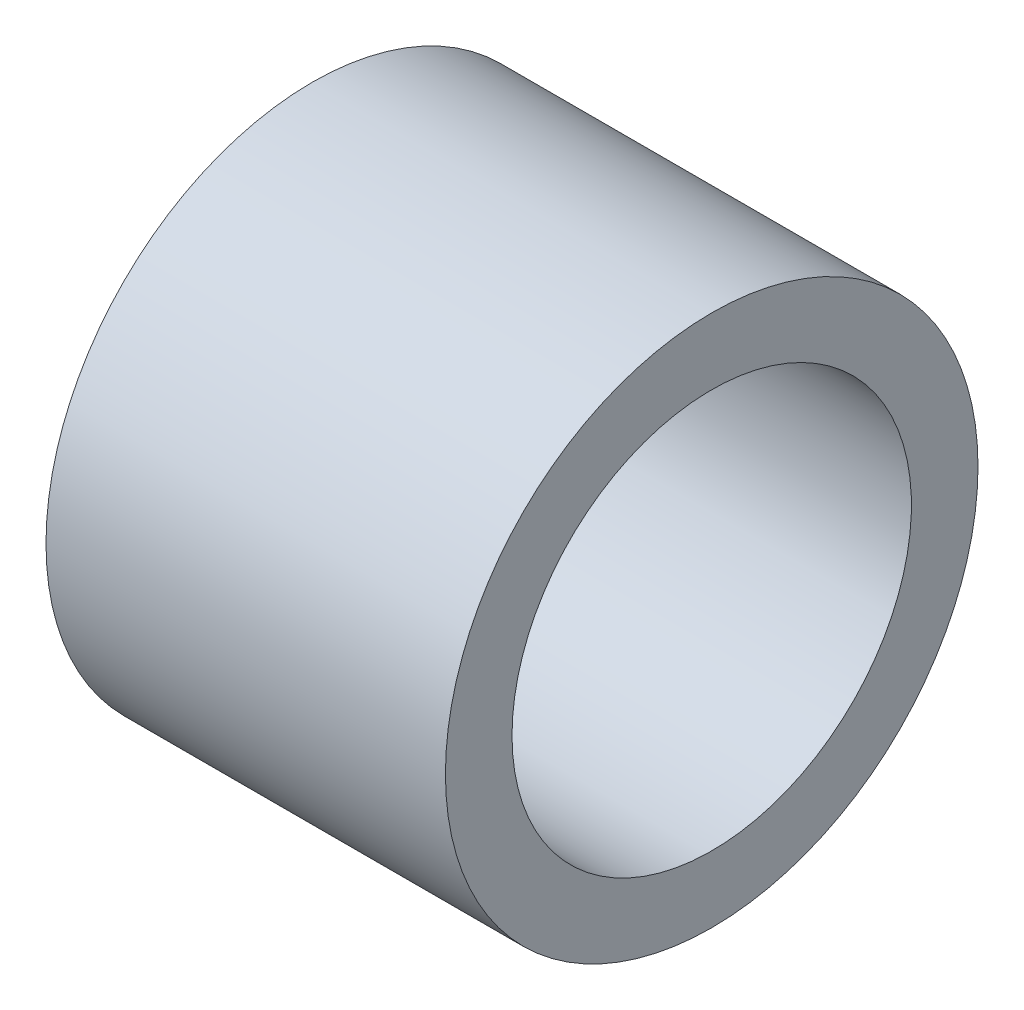
ISO-10303-21;
HEADER;
FILE_DESCRIPTION(('STEP AP214'),'2;1');
FILE_NAME('part.step','',(''),(''),'','','');
FILE_SCHEMA(('AUTOMOTIVE_DESIGN { 1 0 10303 214 1 1 1 1 }'));
ENDSEC;
DATA;
#1=APPLICATION_CONTEXT('core data for automotive mechanical design processes');
#2=APPLICATION_PROTOCOL_DEFINITION('international standard','automotive_design',2000,#1);
#3=PRODUCT_CONTEXT('',#1,'mechanical');
#4=PRODUCT('Part','Part','',(#3));
#5=PRODUCT_RELATED_PRODUCT_CATEGORY('part','',(#4));
#6=PRODUCT_DEFINITION_FORMATION('','',#4);
#7=PRODUCT_DEFINITION_CONTEXT('part definition',#1,'design');
#8=PRODUCT_DEFINITION('design','',#6,#7);
#9=PRODUCT_DEFINITION_SHAPE('','',#8);
#10=(LENGTH_UNIT() NAMED_UNIT(*) SI_UNIT(.MILLI.,.METRE.));
#11=(NAMED_UNIT(*) PLANE_ANGLE_UNIT() SI_UNIT($,.RADIAN.));
#12=(NAMED_UNIT(*) SI_UNIT($,.STERADIAN.) SOLID_ANGLE_UNIT());
#13=UNCERTAINTY_MEASURE_WITH_UNIT(LENGTH_MEASURE(1.E-05),#10,'distance_accuracy_value','');
#14=(GEOMETRIC_REPRESENTATION_CONTEXT(3) GLOBAL_UNCERTAINTY_ASSIGNED_CONTEXT((#13)) GLOBAL_UNIT_ASSIGNED_CONTEXT((#10,
#11,#12)) REPRESENTATION_CONTEXT('',''));
#15=CARTESIAN_POINT('',(0.,0.,0.));
#16=DIRECTION('',(0.,0.,1.));
#17=DIRECTION('',(1.,0.,0.));
#18=AXIS2_PLACEMENT_3D('',#15,#16,#17);
#19=CARTESIAN_POINT('',(9.525,0.,0.));
#20=DIRECTION('',(1.,0.,0.));
#21=DIRECTION('',(0.,0.,-1.));
#22=AXIS2_PLACEMENT_3D('',#19,#20,#21);
#23=PLANE('',#22);
#24=CARTESIAN_POINT('',(9.525,0.,0.));
#25=DIRECTION('',(1.,0.,0.));
#26=DIRECTION('',(0.,0.,-1.));
#27=AXIS2_PLACEMENT_3D('',#24,#25,#26);
#28=CIRCLE('',#27,12.7);
#29=CARTESIAN_POINT('',(9.525,0.,12.7));
#30=VERTEX_POINT('',#29);
#31=EDGE_CURVE('E10',#30,#30,#28,.T.);
#32=ORIENTED_EDGE('',*,*,#31,.T.);
#33=EDGE_LOOP('',(#32));
#34=FACE_BOUND('',#33,.T.);
#35=CARTESIAN_POINT('',(9.525,0.,0.));
#36=DIRECTION('',(1.,0.,0.));
#37=DIRECTION('',(0.,0.,-1.));
#38=AXIS2_PLACEMENT_3D('',#35,#36,#37);
#39=CIRCLE('',#38,9.525);
#40=CARTESIAN_POINT('',(9.525,0.,9.525));
#41=VERTEX_POINT('',#40);
#42=EDGE_CURVE('E43',#41,#41,#39,.T.);
#43=ORIENTED_EDGE('',*,*,#42,.F.);
#44=EDGE_LOOP('',(#43));
#45=FACE_BOUND('',#44,.T.);
#46=ADVANCED_FACE('F32',(#34,#45),#23,.T.);
#47=CARTESIAN_POINT('',(-9.525,0.,0.));
#48=DIRECTION('',(1.,0.,0.));
#49=DIRECTION('',(0.,0.,-1.));
#50=AXIS2_PLACEMENT_3D('',#47,#48,#49);
#51=PLANE('',#50);
#52=CARTESIAN_POINT('',(-9.525,0.,0.));
#53=DIRECTION('',(1.,0.,0.));
#54=DIRECTION('',(0.,0.,-1.));
#55=AXIS2_PLACEMENT_3D('',#52,#53,#54);
#56=CIRCLE('',#55,12.7);
#57=CARTESIAN_POINT('',(-9.525,0.,12.7));
#58=VERTEX_POINT('',#57);
#59=EDGE_CURVE('E36',#58,#58,#56,.T.);
#60=ORIENTED_EDGE('',*,*,#59,.F.);
#61=EDGE_LOOP('',(#60));
#62=FACE_BOUND('',#61,.T.);
#63=CARTESIAN_POINT('',(-9.525,0.,0.));
#64=DIRECTION('',(1.,0.,0.));
#65=DIRECTION('',(0.,0.,-1.));
#66=AXIS2_PLACEMENT_3D('',#63,#64,#65);
#67=CIRCLE('',#66,9.525);
#68=CARTESIAN_POINT('',(-9.525,0.,9.525));
#69=VERTEX_POINT('',#68);
#70=EDGE_CURVE('E45',#69,#69,#67,.T.);
#71=ORIENTED_EDGE('',*,*,#70,.T.);
#72=EDGE_LOOP('',(#71));
#73=FACE_BOUND('',#72,.T.);
#74=ADVANCED_FACE('F55',(#62,#73),#51,.F.);
#75=CARTESIAN_POINT('',(9.525,0.,0.));
#76=DIRECTION('',(-1.,0.,0.));
#77=DIRECTION('',(0.,0.,1.));
#78=AXIS2_PLACEMENT_3D('',#75,#76,#77);
#79=CYLINDRICAL_SURFACE('',#78,12.7);
#80=CARTESIAN_POINT('',(9.525,0.,12.7));
#81=CARTESIAN_POINT('',(9.3265625,0.,12.7));
#82=CARTESIAN_POINT('',(9.128125,0.,12.7));
#83=CARTESIAN_POINT('',(8.73125,0.,12.7));
#84=CARTESIAN_POINT('',(8.5328125,0.,12.7));
#85=CARTESIAN_POINT('',(8.1359375,0.,12.7));
#86=CARTESIAN_POINT('',(7.9375,0.,12.7));
#87=CARTESIAN_POINT('',(7.540625,0.,12.7));
#88=CARTESIAN_POINT('',(7.3421875,0.,12.7));
#89=CARTESIAN_POINT('',(6.9453125,0.,12.7));
#90=CARTESIAN_POINT('',(6.746875,0.,12.7));
#91=CARTESIAN_POINT('',(6.35,0.,12.7));
#92=CARTESIAN_POINT('',(6.1515625,0.,12.7));
#93=CARTESIAN_POINT('',(5.7546875,0.,12.7));
#94=CARTESIAN_POINT('',(5.55625,0.,12.7));
#95=CARTESIAN_POINT('',(5.159375,0.,12.7));
#96=CARTESIAN_POINT('',(4.9609375,0.,12.7));
#97=CARTESIAN_POINT('',(4.5640625,0.,12.7));
#98=CARTESIAN_POINT('',(4.365625,0.,12.7));
#99=CARTESIAN_POINT('',(3.96875,0.,12.7));
#100=CARTESIAN_POINT('',(3.7703125,0.,12.7));
#101=CARTESIAN_POINT('',(3.3734375,0.,12.7));
#102=CARTESIAN_POINT('',(3.175,0.,12.7));
#103=CARTESIAN_POINT('',(2.778125,0.,12.7));
#104=CARTESIAN_POINT('',(2.5796875,0.,12.7));
#105=CARTESIAN_POINT('',(2.1828125,0.,12.7));
#106=CARTESIAN_POINT('',(1.984375,0.,12.7));
#107=CARTESIAN_POINT('',(1.5875,0.,12.7));
#108=CARTESIAN_POINT('',(1.3890625,0.,12.7));
#109=CARTESIAN_POINT('',(0.992187499999999,0.,12.7));
#110=CARTESIAN_POINT('',(0.793749999999999,0.,12.7));
#111=CARTESIAN_POINT('',(0.396874999999998,0.,12.7));
#112=CARTESIAN_POINT('',(0.198437499999998,0.,12.7));
#113=CARTESIAN_POINT('',(-0.198437500000002,0.,12.7));
#114=CARTESIAN_POINT('',(-0.396875000000002,0.,12.7));
#115=CARTESIAN_POINT('',(-0.793750000000002,0.,12.7));
#116=CARTESIAN_POINT('',(-0.992187500000002,0.,12.7));
#117=CARTESIAN_POINT('',(-1.3890625,0.,12.7));
#118=CARTESIAN_POINT('',(-1.5875,0.,12.7));
#119=CARTESIAN_POINT('',(-1.984375,0.,12.7));
#120=CARTESIAN_POINT('',(-2.1828125,0.,12.7));
#121=CARTESIAN_POINT('',(-2.5796875,0.,12.7));
#122=CARTESIAN_POINT('',(-2.778125,0.,12.7));
#123=CARTESIAN_POINT('',(-3.175,0.,12.7));
#124=CARTESIAN_POINT('',(-3.3734375,0.,12.7));
#125=CARTESIAN_POINT('',(-3.7703125,0.,12.7));
#126=CARTESIAN_POINT('',(-3.96875,0.,12.7));
#127=CARTESIAN_POINT('',(-4.365625,0.,12.7));
#128=CARTESIAN_POINT('',(-4.5640625,0.,12.7));
#129=CARTESIAN_POINT('',(-4.9609375,0.,12.7));
#130=CARTESIAN_POINT('',(-5.159375,0.,12.7));
#131=CARTESIAN_POINT('',(-5.55625,0.,12.7));
#132=CARTESIAN_POINT('',(-5.7546875,0.,12.7));
#133=CARTESIAN_POINT('',(-6.1515625,0.,12.7));
#134=CARTESIAN_POINT('',(-6.35,0.,12.7));
#135=CARTESIAN_POINT('',(-6.746875,0.,12.7));
#136=CARTESIAN_POINT('',(-6.9453125,0.,12.7));
#137=CARTESIAN_POINT('',(-7.3421875,0.,12.7));
#138=CARTESIAN_POINT('',(-7.540625,0.,12.7));
#139=CARTESIAN_POINT('',(-7.9375,0.,12.7));
#140=CARTESIAN_POINT('',(-8.1359375,0.,12.7));
#141=CARTESIAN_POINT('',(-8.5328125,0.,12.7));
#142=CARTESIAN_POINT('',(-8.73125,0.,12.7));
#143=CARTESIAN_POINT('',(-9.128125,0.,12.7));
#144=CARTESIAN_POINT('',(-9.3265625,0.,12.7));
#145=CARTESIAN_POINT('',(-9.525,0.,12.7));
#146=B_SPLINE_CURVE_WITH_KNOTS('',3,(#80,#81,#82,#83,#84,#85,#86,#87,#88,#89,#90,#91,#92,#93,
#94,#95,#96,#97,#98,#99,#100,#101,#102,#103,#104,#105,#106,#107,#108,#109,#110,#111,#112,#113,
#114,#115,#116,#117,#118,#119,#120,#121,#122,#123,#124,#125,#126,#127,#128,#129,#130,#131,#132,
#133,#134,#135,#136,#137,#138,#139,#140,#141,#142,#143,#144,#145),.UNSPECIFIED.,.F.,.F.,(4,2,2,
2,2,2,2,2,2,2,2,2,2,2,2,2,2,2,2,2,2,2,2,2,2,2,2,2,2,2,2,2,4),(0.,0.595312499999999,1.190625,
1.7859375,2.38125,2.9765625,3.571875,4.1671875,4.7625,5.3578125,5.953125,6.5484375,7.14375,
7.7390625,8.334375,8.9296875,9.525,10.1203125,10.715625,11.3109375,11.90625,12.5015625,
13.096875,13.6921875,14.2875,14.8828125,15.478125,16.0734375,16.66875,17.2640625,17.859375,
18.4546875,19.05),.UNSPECIFIED.);
#147=EDGE_CURVE('BSEAM34',#30,#58,#146,.T.);
#148=ORIENTED_EDGE('',*,*,#31,.F.);
#149=ORIENTED_EDGE('',*,*,#59,.T.);
#150=ORIENTED_EDGE('',*,*,#147,.T.);
#151=ORIENTED_EDGE('',*,*,#147,.F.);
#152=EDGE_LOOP('',(#148,#150,#149,#151));
#153=FACE_BOUND('',#152,.T.);
#154=ADVANCED_FACE('F34',(#153),#79,.T.);
#155=CARTESIAN_POINT('',(9.525,0.,0.));
#156=DIRECTION('',(-1.,0.,0.));
#157=DIRECTION('',(0.,0.,1.));
#158=AXIS2_PLACEMENT_3D('',#155,#156,#157);
#159=CYLINDRICAL_SURFACE('',#158,9.525);
#160=CARTESIAN_POINT('',(9.525,0.,9.525));
#161=CARTESIAN_POINT('',(9.3265625,0.,9.525));
#162=CARTESIAN_POINT('',(9.128125,0.,9.525));
#163=CARTESIAN_POINT('',(8.73125,0.,9.525));
#164=CARTESIAN_POINT('',(8.5328125,0.,9.525));
#165=CARTESIAN_POINT('',(8.1359375,0.,9.525));
#166=CARTESIAN_POINT('',(7.9375,0.,9.525));
#167=CARTESIAN_POINT('',(7.540625,0.,9.525));
#168=CARTESIAN_POINT('',(7.3421875,0.,9.525));
#169=CARTESIAN_POINT('',(6.9453125,0.,9.525));
#170=CARTESIAN_POINT('',(6.746875,0.,9.525));
#171=CARTESIAN_POINT('',(6.35,0.,9.525));
#172=CARTESIAN_POINT('',(6.1515625,0.,9.525));
#173=CARTESIAN_POINT('',(5.7546875,0.,9.525));
#174=CARTESIAN_POINT('',(5.55625,0.,9.525));
#175=CARTESIAN_POINT('',(5.159375,0.,9.525));
#176=CARTESIAN_POINT('',(4.9609375,0.,9.525));
#177=CARTESIAN_POINT('',(4.5640625,0.,9.525));
#178=CARTESIAN_POINT('',(4.365625,0.,9.525));
#179=CARTESIAN_POINT('',(3.96875,0.,9.525));
#180=CARTESIAN_POINT('',(3.7703125,0.,9.525));
#181=CARTESIAN_POINT('',(3.3734375,0.,9.525));
#182=CARTESIAN_POINT('',(3.175,0.,9.525));
#183=CARTESIAN_POINT('',(2.778125,0.,9.525));
#184=CARTESIAN_POINT('',(2.5796875,0.,9.525));
#185=CARTESIAN_POINT('',(2.1828125,0.,9.525));
#186=CARTESIAN_POINT('',(1.984375,0.,9.525));
#187=CARTESIAN_POINT('',(1.5875,0.,9.525));
#188=CARTESIAN_POINT('',(1.3890625,0.,9.525));
#189=CARTESIAN_POINT('',(0.992187500000001,0.,9.525));
#190=CARTESIAN_POINT('',(0.793750000000001,0.,9.525));
#191=CARTESIAN_POINT('',(0.396875,0.,9.525));
#192=CARTESIAN_POINT('',(0.1984375,0.,9.525));
#193=CARTESIAN_POINT('',(-0.1984375,0.,9.525));
#194=CARTESIAN_POINT('',(-0.396875,0.,9.525));
#195=CARTESIAN_POINT('',(-0.793750000000001,0.,9.525));
#196=CARTESIAN_POINT('',(-0.992187500000001,0.,9.525));
#197=CARTESIAN_POINT('',(-1.3890625,0.,9.525));
#198=CARTESIAN_POINT('',(-1.5875,0.,9.525));
#199=CARTESIAN_POINT('',(-1.984375,0.,9.525));
#200=CARTESIAN_POINT('',(-2.1828125,0.,9.525));
#201=CARTESIAN_POINT('',(-2.5796875,0.,9.525));
#202=CARTESIAN_POINT('',(-2.778125,0.,9.525));
#203=CARTESIAN_POINT('',(-3.175,0.,9.525));
#204=CARTESIAN_POINT('',(-3.3734375,0.,9.525));
#205=CARTESIAN_POINT('',(-3.7703125,0.,9.525));
#206=CARTESIAN_POINT('',(-3.96875,0.,9.525));
#207=CARTESIAN_POINT('',(-4.365625,0.,9.525));
#208=CARTESIAN_POINT('',(-4.5640625,0.,9.525));
#209=CARTESIAN_POINT('',(-4.9609375,0.,9.525));
#210=CARTESIAN_POINT('',(-5.159375,0.,9.525));
#211=CARTESIAN_POINT('',(-5.55625,0.,9.525));
#212=CARTESIAN_POINT('',(-5.7546875,0.,9.525));
#213=CARTESIAN_POINT('',(-6.1515625,0.,9.525));
#214=CARTESIAN_POINT('',(-6.35,0.,9.525));
#215=CARTESIAN_POINT('',(-6.746875,0.,9.525));
#216=CARTESIAN_POINT('',(-6.9453125,0.,9.525));
#217=CARTESIAN_POINT('',(-7.3421875,0.,9.525));
#218=CARTESIAN_POINT('',(-7.540625,0.,9.525));
#219=CARTESIAN_POINT('',(-7.9375,0.,9.525));
#220=CARTESIAN_POINT('',(-8.1359375,0.,9.525));
#221=CARTESIAN_POINT('',(-8.5328125,0.,9.525));
#222=CARTESIAN_POINT('',(-8.73125,0.,9.525));
#223=CARTESIAN_POINT('',(-9.128125,0.,9.525));
#224=CARTESIAN_POINT('',(-9.3265625,0.,9.525));
#225=CARTESIAN_POINT('',(-9.525,0.,9.525));
#226=B_SPLINE_CURVE_WITH_KNOTS('',3,(#160,#161,#162,#163,#164,#165,#166,#167,#168,#169,#170,
#171,#172,#173,#174,#175,#176,#177,#178,#179,#180,#181,#182,#183,#184,#185,#186,#187,#188,#189,
#190,#191,#192,#193,#194,#195,#196,#197,#198,#199,#200,#201,#202,#203,#204,#205,#206,#207,#208,
#209,#210,#211,#212,#213,#214,#215,#216,#217,#218,#219,#220,#221,#222,#223,#224,#225),
.UNSPECIFIED.,.F.,.F.,(4,2,2,2,2,2,2,2,2,2,2,2,2,2,2,2,2,2,2,2,2,2,2,2,2,2,2,2,2,2,2,2,4),(0.,
0.5953125,1.190625,1.7859375,2.38125,2.9765625,3.571875,4.1671875,4.7625,5.3578125,5.953125,
6.5484375,7.14375,7.7390625,8.334375,8.9296875,9.525,10.1203125,10.715625,11.3109375,11.90625,
12.5015625,13.096875,13.6921875,14.2875,14.8828125,15.478125,16.0734375,16.66875,17.2640625,
17.859375,18.4546875,19.05),.UNSPECIFIED.);
#227=EDGE_CURVE('BSEAM51',#41,#69,#226,.T.);
#228=ORIENTED_EDGE('',*,*,#42,.T.);
#229=ORIENTED_EDGE('',*,*,#70,.F.);
#230=ORIENTED_EDGE('',*,*,#227,.T.);
#231=ORIENTED_EDGE('',*,*,#227,.F.);
#232=EDGE_LOOP('',(#228,#230,#229,#231));
#233=FACE_BOUND('',#232,.T.);
#234=ADVANCED_FACE('F51',(#233),#159,.F.);
#235=CLOSED_SHELL('',(#46,#74,#154,#234));
#236=MANIFOLD_SOLID_BREP('B2',#235);
#237=ADVANCED_BREP_SHAPE_REPRESENTATION('',(#18,#236),#14);
#238=SHAPE_DEFINITION_REPRESENTATION(#9,#237);
ENDSEC;
END-ISO-10303-21;
